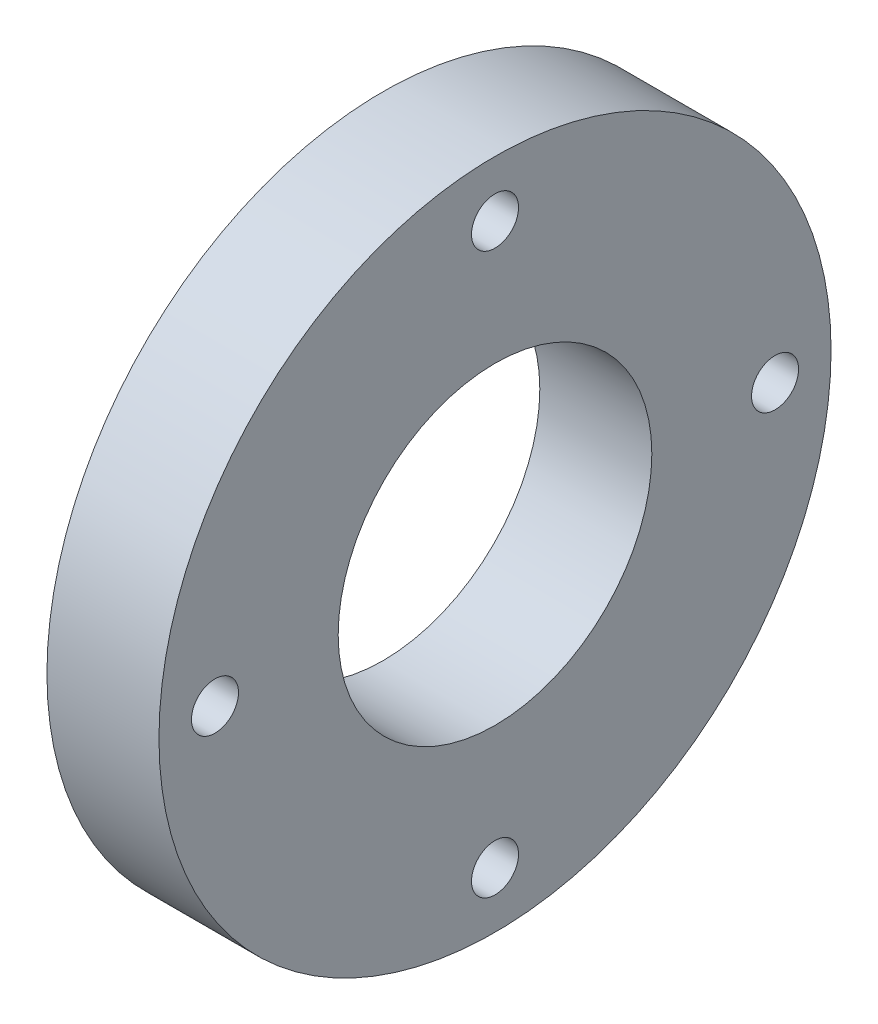
ISO-10303-21;
HEADER;
FILE_DESCRIPTION(('STEP AP214'),'2;1');
FILE_NAME('part.step','',(''),(''),'','','');
FILE_SCHEMA(('AUTOMOTIVE_DESIGN { 1 0 10303 214 1 1 1 1 }'));
ENDSEC;
DATA;
#1=APPLICATION_CONTEXT('core data for automotive mechanical design processes');
#2=APPLICATION_PROTOCOL_DEFINITION('international standard','automotive_design',2000,#1);
#3=PRODUCT_CONTEXT('',#1,'mechanical');
#4=PRODUCT('Part','Part','',(#3));
#5=PRODUCT_RELATED_PRODUCT_CATEGORY('part','',(#4));
#6=PRODUCT_DEFINITION_FORMATION('','',#4);
#7=PRODUCT_DEFINITION_CONTEXT('part definition',#1,'design');
#8=PRODUCT_DEFINITION('design','',#6,#7);
#9=PRODUCT_DEFINITION_SHAPE('','',#8);
#10=(LENGTH_UNIT() NAMED_UNIT(*) SI_UNIT(.MILLI.,.METRE.));
#11=(NAMED_UNIT(*) PLANE_ANGLE_UNIT() SI_UNIT($,.RADIAN.));
#12=(NAMED_UNIT(*) SI_UNIT($,.STERADIAN.) SOLID_ANGLE_UNIT());
#13=UNCERTAINTY_MEASURE_WITH_UNIT(LENGTH_MEASURE(1.E-05),#10,'distance_accuracy_value','');
#14=(GEOMETRIC_REPRESENTATION_CONTEXT(3) GLOBAL_UNCERTAINTY_ASSIGNED_CONTEXT((#13)) GLOBAL_UNIT_ASSIGNED_CONTEXT((#10,
#11,#12)) REPRESENTATION_CONTEXT('',''));
#15=CARTESIAN_POINT('',(0.,0.,0.));
#16=DIRECTION('',(0.,0.,1.));
#17=DIRECTION('',(1.,0.,0.));
#18=AXIS2_PLACEMENT_3D('',#15,#16,#17);
#19=CARTESIAN_POINT('',(21.,0.,0.));
#20=DIRECTION('',(1.,0.,0.));
#21=DIRECTION('',(0.,0.,-1.));
#22=AXIS2_PLACEMENT_3D('',#19,#20,#21);
#23=CYLINDRICAL_SURFACE('',#22,15.);
#24=CARTESIAN_POINT('',(21.,0.,0.));
#25=DIRECTION('',(1.,0.,0.));
#26=DIRECTION('',(0.,0.,-1.));
#27=AXIS2_PLACEMENT_3D('',#24,#25,#26);
#28=CIRCLE('',#27,15.);
#29=CARTESIAN_POINT('',(21.,0.,-15.));
#30=VERTEX_POINT('',#29);
#31=EDGE_CURVE('E10',#30,#30,#28,.T.);
#32=ORIENTED_EDGE('',*,*,#31,.T.);
#33=EDGE_LOOP('',(#32));
#34=FACE_BOUND('',#33,.T.);
#35=CARTESIAN_POINT('',(26.,0.,0.));
#36=DIRECTION('',(1.,0.,0.));
#37=DIRECTION('',(0.,0.,-1.));
#38=AXIS2_PLACEMENT_3D('',#35,#36,#37);
#39=CIRCLE('',#38,15.);
#40=CARTESIAN_POINT('',(26.,0.,-15.));
#41=VERTEX_POINT('',#40);
#42=EDGE_CURVE('E37',#41,#41,#39,.T.);
#43=ORIENTED_EDGE('',*,*,#42,.F.);
#44=EDGE_LOOP('',(#43));
#45=FACE_BOUND('',#44,.T.);
#46=ADVANCED_FACE('F31',(#34,#45),#23,.T.);
#47=CARTESIAN_POINT('',(21.,15.,0.));
#48=DIRECTION('',(-1.,0.,0.));
#49=DIRECTION('',(0.,0.,1.));
#50=AXIS2_PLACEMENT_3D('',#47,#48,#49);
#51=PLANE('',#50);
#52=CARTESIAN_POINT('',(21.,0.,0.));
#53=DIRECTION('',(-1.,0.,0.));
#54=DIRECTION('',(0.,0.,1.));
#55=AXIS2_PLACEMENT_3D('',#52,#53,#54);
#56=CIRCLE('',#55,6.99999999999999);
#57=CARTESIAN_POINT('',(21.,0.,6.99999999999999));
#58=VERTEX_POINT('',#57);
#59=EDGE_CURVE('E45',#58,#58,#56,.T.);
#60=ORIENTED_EDGE('',*,*,#59,.F.);
#61=EDGE_LOOP('',(#60));
#62=FACE_BOUND('',#61,.T.);
#63=ORIENTED_EDGE('',*,*,#31,.F.);
#64=EDGE_LOOP('',(#63));
#65=FACE_BOUND('',#64,.T.);
#66=ADVANCED_FACE('F81',(#62,#65),#51,.T.);
#67=CARTESIAN_POINT('',(26.,0.,0.));
#68=DIRECTION('',(1.,0.,0.));
#69=DIRECTION('',(0.,0.,-1.));
#70=AXIS2_PLACEMENT_3D('',#67,#68,#69);
#71=PLANE('',#70);
#72=CARTESIAN_POINT('',(26.,0.,12.5));
#73=DIRECTION('',(1.,0.,0.));
#74=DIRECTION('',(0.,0.,-1.));
#75=AXIS2_PLACEMENT_3D('',#72,#73,#74);
#76=CIRCLE('',#75,1.04999999999999);
#77=CARTESIAN_POINT('',(26.,0.,11.45));
#78=VERTEX_POINT('',#77);
#79=EDGE_CURVE('E71',#78,#78,#76,.T.);
#80=ORIENTED_EDGE('',*,*,#79,.F.);
#81=EDGE_LOOP('',(#80));
#82=FACE_BOUND('',#81,.T.);
#83=CARTESIAN_POINT('',(26.,0.,-12.5));
#84=DIRECTION('',(1.,0.,0.));
#85=DIRECTION('',(0.,0.,-1.));
#86=AXIS2_PLACEMENT_3D('',#83,#84,#85);
#87=CIRCLE('',#86,1.04999999999999);
#88=CARTESIAN_POINT('',(26.,0.,-13.55));
#89=VERTEX_POINT('',#88);
#90=EDGE_CURVE('E65',#89,#89,#87,.T.);
#91=ORIENTED_EDGE('',*,*,#90,.F.);
#92=EDGE_LOOP('',(#91));
#93=FACE_BOUND('',#92,.T.);
#94=CARTESIAN_POINT('',(26.,-12.5,0.));
#95=DIRECTION('',(1.,0.,0.));
#96=DIRECTION('',(0.,0.,-1.));
#97=AXIS2_PLACEMENT_3D('',#94,#95,#96);
#98=CIRCLE('',#97,1.04999999999999);
#99=CARTESIAN_POINT('',(26.,-12.5,-1.04999999999999));
#100=VERTEX_POINT('',#99);
#101=EDGE_CURVE('E59',#100,#100,#98,.T.);
#102=ORIENTED_EDGE('',*,*,#101,.F.);
#103=EDGE_LOOP('',(#102));
#104=FACE_BOUND('',#103,.T.);
#105=CARTESIAN_POINT('',(26.,12.5,0.));
#106=DIRECTION('',(1.,0.,0.));
#107=DIRECTION('',(0.,0.,-1.));
#108=AXIS2_PLACEMENT_3D('',#105,#106,#107);
#109=CIRCLE('',#108,1.04999999999999);
#110=CARTESIAN_POINT('',(26.,12.5,-1.04999999999999));
#111=VERTEX_POINT('',#110);
#112=EDGE_CURVE('E53',#111,#111,#109,.T.);
#113=ORIENTED_EDGE('',*,*,#112,.F.);
#114=EDGE_LOOP('',(#113));
#115=FACE_BOUND('',#114,.T.);
#116=CARTESIAN_POINT('',(26.,0.,0.));
#117=DIRECTION('',(-1.,0.,0.));
#118=DIRECTION('',(0.,0.,1.));
#119=AXIS2_PLACEMENT_3D('',#116,#117,#118);
#120=CIRCLE('',#119,6.99999999999999);
#121=CARTESIAN_POINT('',(26.,0.,6.99999999999999));
#122=VERTEX_POINT('',#121);
#123=EDGE_CURVE('E41',#122,#122,#120,.T.);
#124=ORIENTED_EDGE('',*,*,#123,.T.);
#125=EDGE_LOOP('',(#124));
#126=FACE_BOUND('',#125,.T.);
#127=ORIENTED_EDGE('',*,*,#42,.T.);
#128=EDGE_LOOP('',(#127));
#129=FACE_BOUND('',#128,.T.);
#130=ADVANCED_FACE('F77',(#82,#93,#104,#115,#126,#129),#71,.T.);
#131=CARTESIAN_POINT('',(21.,0.,0.));
#132=DIRECTION('',(-1.,0.,0.));
#133=DIRECTION('',(0.,0.,1.));
#134=AXIS2_PLACEMENT_3D('',#131,#132,#133);
#135=CYLINDRICAL_SURFACE('',#134,6.99999999999999);
#136=ORIENTED_EDGE('',*,*,#123,.F.);
#137=EDGE_LOOP('',(#136));
#138=FACE_BOUND('',#137,.T.);
#139=ORIENTED_EDGE('',*,*,#59,.T.);
#140=EDGE_LOOP('',(#139));
#141=FACE_BOUND('',#140,.T.);
#142=ADVANCED_FACE('F80',(#138,#141),#135,.F.);
#143=CARTESIAN_POINT('',(23.5,12.5,0.));
#144=DIRECTION('',(-1.,0.,0.));
#145=DIRECTION('',(0.,0.,1.));
#146=AXIS2_PLACEMENT_3D('',#143,#144,#145);
#147=PLANE('',#146);
#148=CARTESIAN_POINT('',(23.5,12.5,0.));
#149=DIRECTION('',(1.,0.,0.));
#150=DIRECTION('',(0.,0.,-1.));
#151=AXIS2_PLACEMENT_3D('',#148,#149,#150);
#152=CIRCLE('',#151,1.04999999999999);
#153=CARTESIAN_POINT('',(23.5,12.5,-1.04999999999999));
#154=VERTEX_POINT('',#153);
#155=EDGE_CURVE('E50',#154,#154,#152,.T.);
#156=ORIENTED_EDGE('',*,*,#155,.T.);
#157=EDGE_LOOP('',(#156));
#158=FACE_BOUND('',#157,.T.);
#159=ADVANCED_FACE('F93',(#158),#147,.F.);
#160=CARTESIAN_POINT('',(26.,12.5,0.));
#161=DIRECTION('',(1.,0.,0.));
#162=DIRECTION('',(0.,0.,-1.));
#163=AXIS2_PLACEMENT_3D('',#160,#161,#162);
#164=CYLINDRICAL_SURFACE('',#163,1.04999999999999);
#165=ORIENTED_EDGE('',*,*,#155,.F.);
#166=EDGE_LOOP('',(#165));
#167=FACE_BOUND('',#166,.T.);
#168=ORIENTED_EDGE('',*,*,#112,.T.);
#169=EDGE_LOOP('',(#168));
#170=FACE_BOUND('',#169,.T.);
#171=ADVANCED_FACE('F105',(#167,#170),#164,.F.);
#172=CARTESIAN_POINT('',(23.5,-12.5,0.));
#173=DIRECTION('',(-1.,0.,0.));
#174=DIRECTION('',(0.,0.,1.));
#175=AXIS2_PLACEMENT_3D('',#172,#173,#174);
#176=PLANE('',#175);
#177=CARTESIAN_POINT('',(23.5,-12.5,0.));
#178=DIRECTION('',(1.,0.,0.));
#179=DIRECTION('',(0.,0.,-1.));
#180=AXIS2_PLACEMENT_3D('',#177,#178,#179);
#181=CIRCLE('',#180,1.04999999999999);
#182=CARTESIAN_POINT('',(23.5,-12.5,-1.04999999999999));
#183=VERTEX_POINT('',#182);
#184=EDGE_CURVE('E56',#183,#183,#181,.T.);
#185=ORIENTED_EDGE('',*,*,#184,.T.);
#186=EDGE_LOOP('',(#185));
#187=FACE_BOUND('',#186,.T.);
#188=ADVANCED_FACE('F109',(#187),#176,.F.);
#189=CARTESIAN_POINT('',(26.,-12.5,0.));
#190=DIRECTION('',(1.,0.,0.));
#191=DIRECTION('',(0.,0.,-1.));
#192=AXIS2_PLACEMENT_3D('',#189,#190,#191);
#193=CYLINDRICAL_SURFACE('',#192,1.04999999999999);
#194=ORIENTED_EDGE('',*,*,#184,.F.);
#195=EDGE_LOOP('',(#194));
#196=FACE_BOUND('',#195,.T.);
#197=ORIENTED_EDGE('',*,*,#101,.T.);
#198=EDGE_LOOP('',(#197));
#199=FACE_BOUND('',#198,.T.);
#200=ADVANCED_FACE('F113',(#196,#199),#193,.F.);
#201=CARTESIAN_POINT('',(23.5,0.,-12.5));
#202=DIRECTION('',(-1.,0.,0.));
#203=DIRECTION('',(0.,0.,1.));
#204=AXIS2_PLACEMENT_3D('',#201,#202,#203);
#205=PLANE('',#204);
#206=CARTESIAN_POINT('',(23.5,0.,-12.5));
#207=DIRECTION('',(1.,0.,0.));
#208=DIRECTION('',(0.,0.,-1.));
#209=AXIS2_PLACEMENT_3D('',#206,#207,#208);
#210=CIRCLE('',#209,1.04999999999999);
#211=CARTESIAN_POINT('',(23.5,0.,-13.55));
#212=VERTEX_POINT('',#211);
#213=EDGE_CURVE('E62',#212,#212,#210,.T.);
#214=ORIENTED_EDGE('',*,*,#213,.T.);
#215=EDGE_LOOP('',(#214));
#216=FACE_BOUND('',#215,.T.);
#217=ADVANCED_FACE('F117',(#216),#205,.F.);
#218=CARTESIAN_POINT('',(26.,0.,-12.5));
#219=DIRECTION('',(1.,0.,0.));
#220=DIRECTION('',(0.,0.,-1.));
#221=AXIS2_PLACEMENT_3D('',#218,#219,#220);
#222=CYLINDRICAL_SURFACE('',#221,1.04999999999999);
#223=ORIENTED_EDGE('',*,*,#213,.F.);
#224=EDGE_LOOP('',(#223));
#225=FACE_BOUND('',#224,.T.);
#226=ORIENTED_EDGE('',*,*,#90,.T.);
#227=EDGE_LOOP('',(#226));
#228=FACE_BOUND('',#227,.T.);
#229=ADVANCED_FACE('F121',(#225,#228),#222,.F.);
#230=CARTESIAN_POINT('',(23.5,0.,12.5));
#231=DIRECTION('',(-1.,0.,0.));
#232=DIRECTION('',(0.,0.,1.));
#233=AXIS2_PLACEMENT_3D('',#230,#231,#232);
#234=PLANE('',#233);
#235=CARTESIAN_POINT('',(23.5,0.,12.5));
#236=DIRECTION('',(1.,0.,0.));
#237=DIRECTION('',(0.,0.,-1.));
#238=AXIS2_PLACEMENT_3D('',#235,#236,#237);
#239=CIRCLE('',#238,1.04999999999999);
#240=CARTESIAN_POINT('',(23.5,0.,11.45));
#241=VERTEX_POINT('',#240);
#242=EDGE_CURVE('E68',#241,#241,#239,.T.);
#243=ORIENTED_EDGE('',*,*,#242,.T.);
#244=EDGE_LOOP('',(#243));
#245=FACE_BOUND('',#244,.T.);
#246=ADVANCED_FACE('F125',(#245),#234,.F.);
#247=CARTESIAN_POINT('',(26.,0.,12.5));
#248=DIRECTION('',(1.,0.,0.));
#249=DIRECTION('',(0.,0.,-1.));
#250=AXIS2_PLACEMENT_3D('',#247,#248,#249);
#251=CYLINDRICAL_SURFACE('',#250,1.04999999999999);
#252=ORIENTED_EDGE('',*,*,#242,.F.);
#253=EDGE_LOOP('',(#252));
#254=FACE_BOUND('',#253,.T.);
#255=ORIENTED_EDGE('',*,*,#79,.T.);
#256=EDGE_LOOP('',(#255));
#257=FACE_BOUND('',#256,.T.);
#258=ADVANCED_FACE('F75',(#254,#257),#251,.F.);
#259=CLOSED_SHELL('',(#46,#66,#130,#142,#159,#171,#188,#200,#217,#229,#246,#258));
#260=MANIFOLD_SOLID_BREP('B2',#259);
#261=ADVANCED_BREP_SHAPE_REPRESENTATION('',(#18,#260),#14);
#262=SHAPE_DEFINITION_REPRESENTATION(#9,#261);
ENDSEC;
END-ISO-10303-21;
